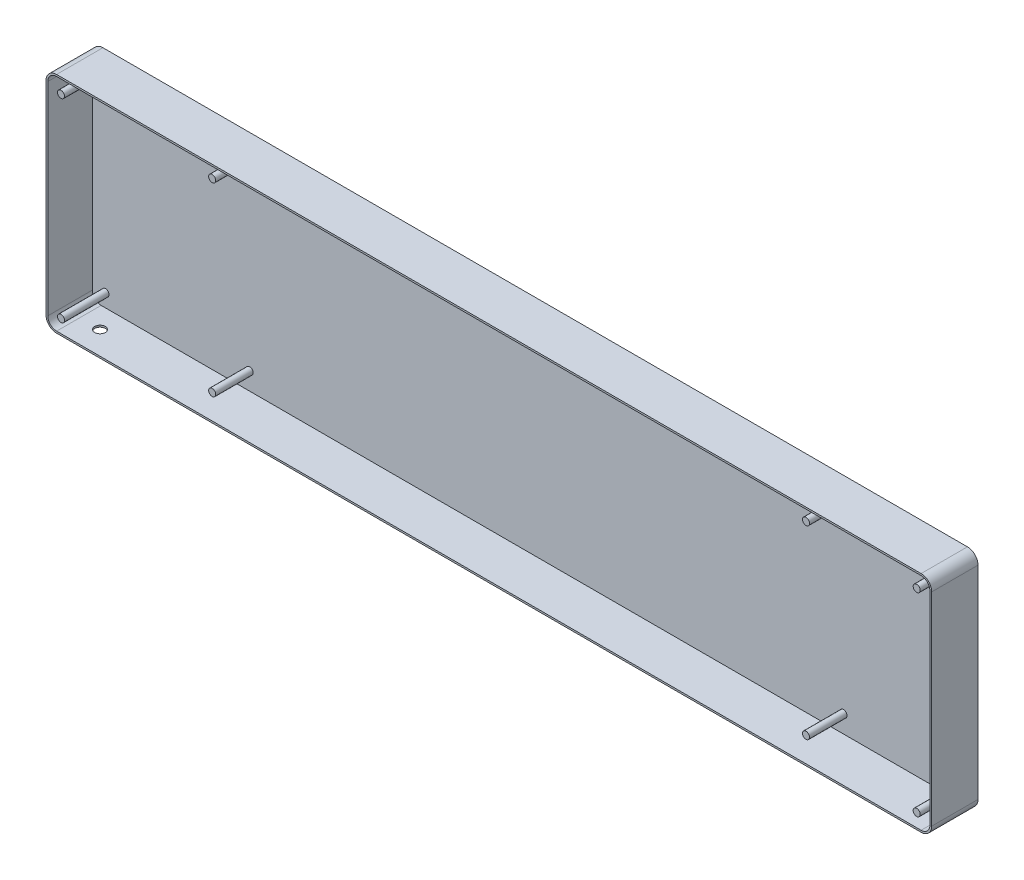
ISO-10303-21;
HEADER;
FILE_DESCRIPTION(('STEP AP214'),'2;1');
FILE_NAME('part.step','',(''),(''),'','','');
FILE_SCHEMA(('AUTOMOTIVE_DESIGN { 1 0 10303 214 1 1 1 1 }'));
ENDSEC;
DATA;
#1=APPLICATION_CONTEXT('core data for automotive mechanical design processes');
#2=APPLICATION_PROTOCOL_DEFINITION('international standard','automotive_design',2000,#1);
#3=PRODUCT_CONTEXT('',#1,'mechanical');
#4=PRODUCT('Part','Part','',(#3));
#5=PRODUCT_RELATED_PRODUCT_CATEGORY('part','',(#4));
#6=PRODUCT_DEFINITION_FORMATION('','',#4);
#7=PRODUCT_DEFINITION_CONTEXT('part definition',#1,'design');
#8=PRODUCT_DEFINITION('design','',#6,#7);
#9=PRODUCT_DEFINITION_SHAPE('','',#8);
#10=(LENGTH_UNIT() NAMED_UNIT(*) SI_UNIT(.MILLI.,.METRE.));
#11=(NAMED_UNIT(*) PLANE_ANGLE_UNIT() SI_UNIT($,.RADIAN.));
#12=(NAMED_UNIT(*) SI_UNIT($,.STERADIAN.) SOLID_ANGLE_UNIT());
#13=UNCERTAINTY_MEASURE_WITH_UNIT(LENGTH_MEASURE(1.E-05),#10,'distance_accuracy_value','');
#14=(GEOMETRIC_REPRESENTATION_CONTEXT(3) GLOBAL_UNCERTAINTY_ASSIGNED_CONTEXT((#13)) GLOBAL_UNIT_ASSIGNED_CONTEXT((#10,
#11,#12)) REPRESENTATION_CONTEXT('',''));
#15=CARTESIAN_POINT('',(0.,0.,0.));
#16=DIRECTION('',(0.,0.,1.));
#17=DIRECTION('',(1.,0.,0.));
#18=AXIS2_PLACEMENT_3D('',#15,#16,#17);
#19=CARTESIAN_POINT('',(694.778858049703,123.537159380943,-50.5));
#20=DIRECTION('',(0.,0.,1.));
#21=DIRECTION('',(1.,0.,0.));
#22=AXIS2_PLACEMENT_3D('',#19,#20,#21);
#23=CYLINDRICAL_SURFACE('',#22,12.);
#24=CARTESIAN_POINT('',(694.778858049703,123.537159380943,0.));
#25=DIRECTION('',(0.,0.,1.));
#26=DIRECTION('',(1.,0.,0.));
#27=AXIS2_PLACEMENT_3D('',#24,#25,#26);
#28=CIRCLE('',#27,12.);
#29=CARTESIAN_POINT('',(706.778858049703,123.537159380943,0.));
#30=VERTEX_POINT('',#29);
#31=CARTESIAN_POINT('',(694.778858049703,135.537159380943,0.));
#32=VERTEX_POINT('',#31);
#33=EDGE_CURVE('E249',#30,#32,#28,.T.);
#34=ORIENTED_EDGE('',*,*,#33,.F.);
#35=DIRECTION('',(0.,0.,1.));
#36=VECTOR('',#35,1.);
#37=CARTESIAN_POINT('',(706.778858049703,123.537159380943,-50.5));
#38=LINE('',#37,#36);
#39=CARTESIAN_POINT('',(706.778858049703,123.537159380943,-52.5));
#40=VERTEX_POINT('',#39);
#41=EDGE_CURVE('E284',#40,#30,#38,.T.);
#42=ORIENTED_EDGE('',*,*,#41,.F.);
#43=CARTESIAN_POINT('',(694.778858049703,123.537159380943,-52.5));
#44=DIRECTION('',(0.,0.,-1.));
#45=DIRECTION('',(-1.,0.,0.));
#46=AXIS2_PLACEMENT_3D('',#43,#44,#45);
#47=CIRCLE('',#46,12.);
#48=CARTESIAN_POINT('',(694.778858049703,135.537159380943,-52.5));
#49=VERTEX_POINT('',#48);
#50=EDGE_CURVE('E193',#49,#40,#47,.T.);
#51=ORIENTED_EDGE('',*,*,#50,.F.);
#52=DIRECTION('',(0.,0.,1.));
#53=VECTOR('',#52,1.);
#54=CARTESIAN_POINT('',(694.778858049703,135.537159380943,-50.5));
#55=LINE('',#54,#53);
#56=EDGE_CURVE('E283',#49,#32,#55,.T.);
#57=ORIENTED_EDGE('',*,*,#56,.T.);
#58=EDGE_LOOP('',(#34,#42,#51,#57));
#59=FACE_BOUND('',#58,.T.);
#60=ADVANCED_FACE('F44',(#59),#23,.T.);
#61=CARTESIAN_POINT('',(706.778858049703,-106.462840619057,-50.5));
#62=DIRECTION('',(1.,0.,0.));
#63=DIRECTION('',(0.,0.,-1.));
#64=AXIS2_PLACEMENT_3D('',#61,#62,#63);
#65=PLANE('',#64);
#66=DIRECTION('',(0.,1.,0.));
#67=VECTOR('',#66,1.);
#68=CARTESIAN_POINT('',(706.778858049703,-106.462840619057,0.));
#69=LINE('',#68,#67);
#70=CARTESIAN_POINT('',(706.778858049703,-106.462840619057,0.));
#71=VERTEX_POINT('',#70);
#72=EDGE_CURVE('E280',#71,#30,#69,.T.);
#73=ORIENTED_EDGE('',*,*,#72,.F.);
#74=DIRECTION('',(0.,0.,1.));
#75=VECTOR('',#74,1.);
#76=CARTESIAN_POINT('',(706.778858049703,-106.462840619057,-50.5));
#77=LINE('',#76,#75);
#78=CARTESIAN_POINT('',(706.778858049703,-106.462840619057,-52.5));
#79=VERTEX_POINT('',#78);
#80=EDGE_CURVE('E287',#79,#71,#77,.T.);
#81=ORIENTED_EDGE('',*,*,#80,.F.);
#82=DIRECTION('',(0.,-1.,0.));
#83=VECTOR('',#82,1.);
#84=CARTESIAN_POINT('',(706.778858049703,-106.462840619057,-52.5));
#85=LINE('',#84,#83);
#86=EDGE_CURVE('E196',#40,#79,#85,.T.);
#87=ORIENTED_EDGE('',*,*,#86,.F.);
#88=ORIENTED_EDGE('',*,*,#41,.T.);
#89=EDGE_LOOP('',(#73,#81,#87,#88));
#90=FACE_BOUND('',#89,.T.);
#91=ADVANCED_FACE('F374',(#90),#65,.T.);
#92=CARTESIAN_POINT('',(694.778858049703,-106.462840619057,-50.5));
#93=DIRECTION('',(0.,0.,1.));
#94=DIRECTION('',(1.,0.,0.));
#95=AXIS2_PLACEMENT_3D('',#92,#93,#94);
#96=CYLINDRICAL_SURFACE('',#95,12.0000000000001);
#97=CARTESIAN_POINT('',(694.778858049703,-106.462840619057,0.));
#98=DIRECTION('',(0.,0.,1.));
#99=DIRECTION('',(1.,0.,0.));
#100=AXIS2_PLACEMENT_3D('',#97,#98,#99);
#101=CIRCLE('',#100,12.0000000000001);
#102=CARTESIAN_POINT('',(694.778858049703,-118.462840619057,0.));
#103=VERTEX_POINT('',#102);
#104=EDGE_CURVE('E277',#103,#71,#101,.T.);
#105=ORIENTED_EDGE('',*,*,#104,.F.);
#106=DIRECTION('',(0.,0.,1.));
#107=VECTOR('',#106,1.);
#108=CARTESIAN_POINT('',(694.778858049703,-118.462840619057,-50.5));
#109=LINE('',#108,#107);
#110=CARTESIAN_POINT('',(694.778858049703,-118.462840619057,-52.5));
#111=VERTEX_POINT('',#110);
#112=EDGE_CURVE('E289',#111,#103,#109,.T.);
#113=ORIENTED_EDGE('',*,*,#112,.F.);
#114=CARTESIAN_POINT('',(694.778858049703,-106.462840619057,-52.5));
#115=DIRECTION('',(0.,0.,-1.));
#116=DIRECTION('',(-1.,0.,0.));
#117=AXIS2_PLACEMENT_3D('',#114,#115,#116);
#118=CIRCLE('',#117,12.0000000000001);
#119=EDGE_CURVE('E199',#79,#111,#118,.T.);
#120=ORIENTED_EDGE('',*,*,#119,.F.);
#121=ORIENTED_EDGE('',*,*,#80,.T.);
#122=EDGE_LOOP('',(#105,#113,#120,#121));
#123=FACE_BOUND('',#122,.T.);
#124=ADVANCED_FACE('F379',(#123),#96,.T.);
#125=CARTESIAN_POINT('',(-285.221141950297,-118.462840619057,-50.5));
#126=DIRECTION('',(0.,-1.,0.));
#127=DIRECTION('',(0.,0.,-1.));
#128=AXIS2_PLACEMENT_3D('',#125,#126,#127);
#129=PLANE('',#128);
#130=CARTESIAN_POINT('',(-262.221141950297,-118.462840619057,-26.25));
#131=DIRECTION('',(0.,-1.,0.));
#132=DIRECTION('',(0.,0.,-1.));
#133=AXIS2_PLACEMENT_3D('',#130,#131,#132);
#134=CIRCLE('',#133,5.99999999999999);
#135=CARTESIAN_POINT('',(-262.221141950297,-118.462840619057,-32.25));
#136=VERTEX_POINT('',#135);
#137=EDGE_CURVE('E735',#136,#136,#134,.T.);
#138=ORIENTED_EDGE('',*,*,#137,.F.);
#139=EDGE_LOOP('',(#138));
#140=FACE_BOUND('',#139,.T.);
#141=DIRECTION('',(1.,0.,0.));
#142=VECTOR('',#141,1.);
#143=CARTESIAN_POINT('',(-285.221141950297,-118.462840619057,0.));
#144=LINE('',#143,#142);
#145=CARTESIAN_POINT('',(-285.221141950297,-118.462840619057,0.));
#146=VERTEX_POINT('',#145);
#147=EDGE_CURVE('E274',#146,#103,#144,.T.);
#148=ORIENTED_EDGE('',*,*,#147,.F.);
#149=DIRECTION('',(0.,0.,1.));
#150=VECTOR('',#149,1.);
#151=CARTESIAN_POINT('',(-285.221141950297,-118.462840619057,-50.5));
#152=LINE('',#151,#150);
#153=CARTESIAN_POINT('',(-285.221141950297,-118.462840619057,-52.5));
#154=VERTEX_POINT('',#153);
#155=EDGE_CURVE('E166',#154,#146,#152,.T.);
#156=ORIENTED_EDGE('',*,*,#155,.F.);
#157=DIRECTION('',(-1.,0.,0.));
#158=VECTOR('',#157,1.);
#159=CARTESIAN_POINT('',(-285.221141950297,-118.462840619057,-52.5));
#160=LINE('',#159,#158);
#161=EDGE_CURVE('E181',#111,#154,#160,.T.);
#162=ORIENTED_EDGE('',*,*,#161,.F.);
#163=ORIENTED_EDGE('',*,*,#112,.T.);
#164=EDGE_LOOP('',(#148,#156,#162,#163));
#165=FACE_BOUND('',#164,.T.);
#166=ADVANCED_FACE('F392',(#140,#165),#129,.T.);
#167=CARTESIAN_POINT('',(-285.221141950297,-106.462840619057,-50.5));
#168=DIRECTION('',(0.,0.,1.));
#169=DIRECTION('',(1.,0.,0.));
#170=AXIS2_PLACEMENT_3D('',#167,#168,#169);
#171=CYLINDRICAL_SURFACE('',#170,12.);
#172=CARTESIAN_POINT('',(-285.221141950297,-106.462840619057,0.));
#173=DIRECTION('',(0.,0.,1.));
#174=DIRECTION('',(1.,0.,0.));
#175=AXIS2_PLACEMENT_3D('',#172,#173,#174);
#176=CIRCLE('',#175,12.);
#177=CARTESIAN_POINT('',(-297.221141950297,-106.462840619057,0.));
#178=VERTEX_POINT('',#177);
#179=EDGE_CURVE('E162',#178,#146,#176,.T.);
#180=ORIENTED_EDGE('',*,*,#179,.F.);
#181=DIRECTION('',(0.,0.,1.));
#182=VECTOR('',#181,1.);
#183=CARTESIAN_POINT('',(-297.221141950297,-106.462840619057,-50.5));
#184=LINE('',#183,#182);
#185=CARTESIAN_POINT('',(-297.221141950297,-106.462840619057,-52.5));
#186=VERTEX_POINT('',#185);
#187=EDGE_CURVE('E156',#186,#178,#184,.T.);
#188=ORIENTED_EDGE('',*,*,#187,.F.);
#189=CARTESIAN_POINT('',(-285.221141950297,-106.462840619057,-52.5));
#190=DIRECTION('',(0.,0.,-1.));
#191=DIRECTION('',(-1.,0.,0.));
#192=AXIS2_PLACEMENT_3D('',#189,#190,#191);
#193=CIRCLE('',#192,12.);
#194=EDGE_CURVE('E160',#154,#186,#193,.T.);
#195=ORIENTED_EDGE('',*,*,#194,.F.);
#196=ORIENTED_EDGE('',*,*,#155,.T.);
#197=EDGE_LOOP('',(#180,#188,#195,#196));
#198=FACE_BOUND('',#197,.T.);
#199=ADVANCED_FACE('F158',(#198),#171,.T.);
#200=CARTESIAN_POINT('',(-297.221141950297,123.537159380943,-50.5));
#201=DIRECTION('',(-1.,0.,0.));
#202=DIRECTION('',(0.,0.,1.));
#203=AXIS2_PLACEMENT_3D('',#200,#201,#202);
#204=PLANE('',#203);
#205=DIRECTION('',(0.,-1.,0.));
#206=VECTOR('',#205,1.);
#207=CARTESIAN_POINT('',(-297.221141950297,123.537159380943,0.));
#208=LINE('',#207,#206);
#209=CARTESIAN_POINT('',(-297.221141950297,123.537159380943,0.));
#210=VERTEX_POINT('',#209);
#211=EDGE_CURVE('E271',#210,#178,#208,.T.);
#212=ORIENTED_EDGE('',*,*,#211,.F.);
#213=DIRECTION('',(0.,0.,1.));
#214=VECTOR('',#213,1.);
#215=CARTESIAN_POINT('',(-297.221141950297,123.537159380943,-50.5));
#216=LINE('',#215,#214);
#217=CARTESIAN_POINT('',(-297.221141950297,123.537159380943,-52.5));
#218=VERTEX_POINT('',#217);
#219=EDGE_CURVE('E167',#218,#210,#216,.T.);
#220=ORIENTED_EDGE('',*,*,#219,.F.);
#221=DIRECTION('',(0.,1.,0.));
#222=VECTOR('',#221,1.);
#223=CARTESIAN_POINT('',(-297.221141950297,123.537159380943,-52.5));
#224=LINE('',#223,#222);
#225=EDGE_CURVE('E170',#186,#218,#224,.T.);
#226=ORIENTED_EDGE('',*,*,#225,.F.);
#227=ORIENTED_EDGE('',*,*,#187,.T.);
#228=EDGE_LOOP('',(#212,#220,#226,#227));
#229=FACE_BOUND('',#228,.T.);
#230=ADVANCED_FACE('F171',(#229),#204,.T.);
#231=CARTESIAN_POINT('',(-285.221141950297,123.537159380943,-50.5));
#232=DIRECTION('',(0.,0.,1.));
#233=DIRECTION('',(1.,0.,0.));
#234=AXIS2_PLACEMENT_3D('',#231,#232,#233);
#235=CYLINDRICAL_SURFACE('',#234,12.0000000000001);
#236=CARTESIAN_POINT('',(-285.221141950297,123.537159380943,0.));
#237=DIRECTION('',(0.,0.,1.));
#238=DIRECTION('',(1.,0.,0.));
#239=AXIS2_PLACEMENT_3D('',#236,#237,#238);
#240=CIRCLE('',#239,12.0000000000001);
#241=CARTESIAN_POINT('',(-285.221141950297,135.537159380943,0.));
#242=VERTEX_POINT('',#241);
#243=EDGE_CURVE('E268',#242,#210,#240,.T.);
#244=ORIENTED_EDGE('',*,*,#243,.F.);
#245=DIRECTION('',(0.,0.,1.));
#246=VECTOR('',#245,1.);
#247=CARTESIAN_POINT('',(-285.221141950297,135.537159380943,-50.5));
#248=LINE('',#247,#246);
#249=CARTESIAN_POINT('',(-285.221141950297,135.537159380943,-52.5));
#250=VERTEX_POINT('',#249);
#251=EDGE_CURVE('E293',#250,#242,#248,.T.);
#252=ORIENTED_EDGE('',*,*,#251,.F.);
#253=CARTESIAN_POINT('',(-285.221141950297,123.537159380943,-52.5));
#254=DIRECTION('',(0.,0.,-1.));
#255=DIRECTION('',(-1.,0.,0.));
#256=AXIS2_PLACEMENT_3D('',#253,#254,#255);
#257=CIRCLE('',#256,12.0000000000001);
#258=EDGE_CURVE('E175',#218,#250,#257,.T.);
#259=ORIENTED_EDGE('',*,*,#258,.F.);
#260=ORIENTED_EDGE('',*,*,#219,.T.);
#261=EDGE_LOOP('',(#244,#252,#259,#260));
#262=FACE_BOUND('',#261,.T.);
#263=ADVANCED_FACE('F395',(#262),#235,.T.);
#264=CARTESIAN_POINT('',(694.778858049703,135.537159380943,-50.5));
#265=DIRECTION('',(0.,1.,0.));
#266=DIRECTION('',(0.,0.,1.));
#267=AXIS2_PLACEMENT_3D('',#264,#265,#266);
#268=PLANE('',#267);
#269=DIRECTION('',(-1.,0.,0.));
#270=VECTOR('',#269,1.);
#271=CARTESIAN_POINT('',(694.778858049703,135.537159380943,0.));
#272=LINE('',#271,#270);
#273=EDGE_CURVE('E265',#32,#242,#272,.T.);
#274=ORIENTED_EDGE('',*,*,#273,.F.);
#275=ORIENTED_EDGE('',*,*,#56,.F.);
#276=DIRECTION('',(1.,0.,0.));
#277=VECTOR('',#276,1.);
#278=CARTESIAN_POINT('',(694.778858049703,135.537159380943,-52.5));
#279=LINE('',#278,#277);
#280=EDGE_CURVE('E190',#250,#49,#279,.T.);
#281=ORIENTED_EDGE('',*,*,#280,.F.);
#282=ORIENTED_EDGE('',*,*,#251,.T.);
#283=EDGE_LOOP('',(#274,#275,#281,#282));
#284=FACE_BOUND('',#283,.T.);
#285=ADVANCED_FACE('F398',(#284),#268,.T.);
#286=CARTESIAN_POINT('',(694.778858049703,123.537159380943,0.));
#287=DIRECTION('',(0.,0.,1.));
#288=DIRECTION('',(1.,0.,0.));
#289=AXIS2_PLACEMENT_3D('',#286,#287,#288);
#290=PLANE('',#289);
#291=CARTESIAN_POINT('',(-285.221141950297,-106.462840619057,0.));
#292=DIRECTION('',(0.,0.,1.));
#293=DIRECTION('',(1.,0.,0.));
#294=AXIS2_PLACEMENT_3D('',#291,#292,#293);
#295=CIRCLE('',#294,10.);
#296=CARTESIAN_POINT('',(-295.221141950297,-106.462840619057,0.));
#297=VERTEX_POINT('',#296);
#298=CARTESIAN_POINT('',(-285.221141950297,-116.462840619057,0.));
#299=VERTEX_POINT('',#298);
#300=EDGE_CURVE('E66',#297,#299,#295,.T.);
#301=ORIENTED_EDGE('',*,*,#300,.F.);
#302=DIRECTION('',(0.,-1.,0.));
#303=VECTOR('',#302,1.);
#304=CARTESIAN_POINT('',(-295.221141950297,123.537159380943,0.));
#305=LINE('',#304,#303);
#306=CARTESIAN_POINT('',(-295.221141950297,123.537159380943,0.));
#307=VERTEX_POINT('',#306);
#308=EDGE_CURVE('E206',#307,#297,#305,.T.);
#309=ORIENTED_EDGE('',*,*,#308,.F.);
#310=CARTESIAN_POINT('',(-285.221141950297,123.537159380943,0.));
#311=DIRECTION('',(0.,0.,1.));
#312=DIRECTION('',(1.,0.,0.));
#313=AXIS2_PLACEMENT_3D('',#310,#311,#312);
#314=CIRCLE('',#313,10.);
#315=CARTESIAN_POINT('',(-285.221141950297,133.537159380943,0.));
#316=VERTEX_POINT('',#315);
#317=EDGE_CURVE('E242',#316,#307,#314,.T.);
#318=ORIENTED_EDGE('',*,*,#317,.F.);
#319=DIRECTION('',(-1.,0.,0.));
#320=VECTOR('',#319,1.);
#321=CARTESIAN_POINT('',(694.778858049703,133.537159380943,0.));
#322=LINE('',#321,#320);
#323=CARTESIAN_POINT('',(694.778858049703,133.537159380943,0.));
#324=VERTEX_POINT('',#323);
#325=EDGE_CURVE('E239',#324,#316,#322,.T.);
#326=ORIENTED_EDGE('',*,*,#325,.F.);
#327=CARTESIAN_POINT('',(694.778858049703,123.537159380943,0.));
#328=DIRECTION('',(0.,0.,1.));
#329=DIRECTION('',(1.,0.,0.));
#330=AXIS2_PLACEMENT_3D('',#327,#328,#329);
#331=CIRCLE('',#330,10.);
#332=CARTESIAN_POINT('',(704.778858049703,123.537159380943,0.));
#333=VERTEX_POINT('',#332);
#334=EDGE_CURVE('E236',#333,#324,#331,.T.);
#335=ORIENTED_EDGE('',*,*,#334,.F.);
#336=DIRECTION('',(0.,1.,0.));
#337=VECTOR('',#336,1.);
#338=CARTESIAN_POINT('',(704.778858049703,-106.462840619057,0.));
#339=LINE('',#338,#337);
#340=CARTESIAN_POINT('',(704.778858049703,-106.462840619057,0.));
#341=VERTEX_POINT('',#340);
#342=EDGE_CURVE('E233',#341,#333,#339,.T.);
#343=ORIENTED_EDGE('',*,*,#342,.F.);
#344=CARTESIAN_POINT('',(694.778858049703,-106.462840619057,0.));
#345=DIRECTION('',(0.,0.,1.));
#346=DIRECTION('',(1.,0.,0.));
#347=AXIS2_PLACEMENT_3D('',#344,#345,#346);
#348=CIRCLE('',#347,10.);
#349=CARTESIAN_POINT('',(694.778858049703,-116.462840619057,0.));
#350=VERTEX_POINT('',#349);
#351=EDGE_CURVE('E230',#350,#341,#348,.T.);
#352=ORIENTED_EDGE('',*,*,#351,.F.);
#353=DIRECTION('',(1.,0.,0.));
#354=VECTOR('',#353,1.);
#355=CARTESIAN_POINT('',(-285.221141950297,-116.462840619057,0.));
#356=LINE('',#355,#354);
#357=EDGE_CURVE('E227',#299,#350,#356,.T.);
#358=ORIENTED_EDGE('',*,*,#357,.F.);
#359=EDGE_LOOP('',(#301,#309,#318,#326,#335,#343,#352,#358));
#360=FACE_BOUND('',#359,.T.);
#361=ORIENTED_EDGE('',*,*,#33,.T.);
#362=ORIENTED_EDGE('',*,*,#273,.T.);
#363=ORIENTED_EDGE('',*,*,#243,.T.);
#364=ORIENTED_EDGE('',*,*,#211,.T.);
#365=ORIENTED_EDGE('',*,*,#179,.T.);
#366=ORIENTED_EDGE('',*,*,#147,.T.);
#367=ORIENTED_EDGE('',*,*,#104,.T.);
#368=ORIENTED_EDGE('',*,*,#72,.T.);
#369=EDGE_LOOP('',(#361,#362,#363,#364,#365,#366,#367,#368));
#370=FACE_BOUND('',#369,.T.);
#371=ADVANCED_FACE('F355',(#360,#370),#290,.T.);
#372=CARTESIAN_POINT('',(-285.221141950297,-106.462840619057,-50.5));
#373=DIRECTION('',(0.,0.,1.));
#374=DIRECTION('',(1.,0.,0.));
#375=AXIS2_PLACEMENT_3D('',#372,#373,#374);
#376=CYLINDRICAL_SURFACE('',#375,10.);
#377=ORIENTED_EDGE('',*,*,#300,.T.);
#378=DIRECTION('',(0.,0.,1.));
#379=VECTOR('',#378,1.);
#380=CARTESIAN_POINT('',(-285.221141950297,-116.462840619057,-50.5));
#381=LINE('',#380,#379);
#382=CARTESIAN_POINT('',(-285.221141950297,-116.462840619057,-50.5));
#383=VERTEX_POINT('',#382);
#384=EDGE_CURVE('E225',#383,#299,#381,.T.);
#385=ORIENTED_EDGE('',*,*,#384,.F.);
#386=CARTESIAN_POINT('',(-285.221141950297,-106.462840619057,-50.5));
#387=DIRECTION('',(0.,0.,1.));
#388=DIRECTION('',(1.,0.,0.));
#389=AXIS2_PLACEMENT_3D('',#386,#387,#388);
#390=CIRCLE('',#389,10.);
#391=CARTESIAN_POINT('',(-295.221141950297,-106.462840619057,-50.5));
#392=VERTEX_POINT('',#391);
#393=EDGE_CURVE('E202',#392,#383,#390,.T.);
#394=ORIENTED_EDGE('',*,*,#393,.F.);
#395=DIRECTION('',(0.,0.,1.));
#396=VECTOR('',#395,1.);
#397=CARTESIAN_POINT('',(-295.221141950297,-106.462840619057,-50.5));
#398=LINE('',#397,#396);
#399=EDGE_CURVE('E247',#392,#297,#398,.T.);
#400=ORIENTED_EDGE('',*,*,#399,.T.);
#401=EDGE_LOOP('',(#377,#385,#394,#400));
#402=FACE_BOUND('',#401,.T.);
#403=ADVANCED_FACE('F345',(#402),#376,.F.);
#404=CARTESIAN_POINT('',(-295.221141950297,123.537159380943,-50.5));
#405=DIRECTION('',(-1.,0.,0.));
#406=DIRECTION('',(0.,0.,1.));
#407=AXIS2_PLACEMENT_3D('',#404,#405,#406);
#408=PLANE('',#407);
#409=ORIENTED_EDGE('',*,*,#308,.T.);
#410=ORIENTED_EDGE('',*,*,#399,.F.);
#411=DIRECTION('',(0.,-1.,0.));
#412=VECTOR('',#411,1.);
#413=CARTESIAN_POINT('',(-295.221141950297,123.537159380943,-50.5));
#414=LINE('',#413,#412);
#415=CARTESIAN_POINT('',(-295.221141950297,123.537159380943,-50.5));
#416=VERTEX_POINT('',#415);
#417=EDGE_CURVE('E222',#416,#392,#414,.T.);
#418=ORIENTED_EDGE('',*,*,#417,.F.);
#419=DIRECTION('',(0.,0.,1.));
#420=VECTOR('',#419,1.);
#421=CARTESIAN_POINT('',(-295.221141950297,123.537159380943,-50.5));
#422=LINE('',#421,#420);
#423=EDGE_CURVE('E250',#416,#307,#422,.T.);
#424=ORIENTED_EDGE('',*,*,#423,.T.);
#425=EDGE_LOOP('',(#409,#410,#418,#424));
#426=FACE_BOUND('',#425,.T.);
#427=ADVANCED_FACE('F343',(#426),#408,.F.);
#428=CARTESIAN_POINT('',(-285.221141950297,123.537159380943,-50.5));
#429=DIRECTION('',(0.,0.,1.));
#430=DIRECTION('',(1.,0.,0.));
#431=AXIS2_PLACEMENT_3D('',#428,#429,#430);
#432=CYLINDRICAL_SURFACE('',#431,10.);
#433=ORIENTED_EDGE('',*,*,#317,.T.);
#434=ORIENTED_EDGE('',*,*,#423,.F.);
#435=CARTESIAN_POINT('',(-285.221141950297,123.537159380943,-50.5));
#436=DIRECTION('',(0.,0.,1.));
#437=DIRECTION('',(1.,0.,0.));
#438=AXIS2_PLACEMENT_3D('',#435,#436,#437);
#439=CIRCLE('',#438,10.);
#440=CARTESIAN_POINT('',(-285.221141950297,133.537159380943,-50.5));
#441=VERTEX_POINT('',#440);
#442=EDGE_CURVE('E219',#441,#416,#439,.T.);
#443=ORIENTED_EDGE('',*,*,#442,.F.);
#444=DIRECTION('',(0.,0.,1.));
#445=VECTOR('',#444,1.);
#446=CARTESIAN_POINT('',(-285.221141950297,133.537159380943,-50.5));
#447=LINE('',#446,#445);
#448=EDGE_CURVE('E252',#441,#316,#447,.T.);
#449=ORIENTED_EDGE('',*,*,#448,.T.);
#450=EDGE_LOOP('',(#433,#434,#443,#449));
#451=FACE_BOUND('',#450,.T.);
#452=ADVANCED_FACE('F339',(#451),#432,.F.);
#453=CARTESIAN_POINT('',(694.778858049703,133.537159380943,-50.5));
#454=DIRECTION('',(0.,1.,0.));
#455=DIRECTION('',(-1.,0.,0.));
#456=AXIS2_PLACEMENT_3D('',#453,#454,#455);
#457=PLANE('',#456);
#458=ORIENTED_EDGE('',*,*,#325,.T.);
#459=ORIENTED_EDGE('',*,*,#448,.F.);
#460=DIRECTION('',(-1.,0.,0.));
#461=VECTOR('',#460,1.);
#462=CARTESIAN_POINT('',(694.778858049703,133.537159380943,-50.5));
#463=LINE('',#462,#461);
#464=CARTESIAN_POINT('',(694.778858049703,133.537159380943,-50.5));
#465=VERTEX_POINT('',#464);
#466=EDGE_CURVE('E216',#465,#441,#463,.T.);
#467=ORIENTED_EDGE('',*,*,#466,.F.);
#468=DIRECTION('',(0.,0.,1.));
#469=VECTOR('',#468,1.);
#470=CARTESIAN_POINT('',(694.778858049703,133.537159380943,-50.5));
#471=LINE('',#470,#469);
#472=EDGE_CURVE('E254',#465,#324,#471,.T.);
#473=ORIENTED_EDGE('',*,*,#472,.T.);
#474=EDGE_LOOP('',(#458,#459,#467,#473));
#475=FACE_BOUND('',#474,.T.);
#476=ADVANCED_FACE('F364',(#475),#457,.F.);
#477=CARTESIAN_POINT('',(694.778858049703,123.537159380943,-50.5));
#478=DIRECTION('',(0.,0.,1.));
#479=DIRECTION('',(1.,0.,0.));
#480=AXIS2_PLACEMENT_3D('',#477,#478,#479);
#481=CYLINDRICAL_SURFACE('',#480,10.);
#482=ORIENTED_EDGE('',*,*,#334,.T.);
#483=ORIENTED_EDGE('',*,*,#472,.F.);
#484=CARTESIAN_POINT('',(694.778858049703,123.537159380943,-50.5));
#485=DIRECTION('',(0.,0.,1.));
#486=DIRECTION('',(1.,0.,0.));
#487=AXIS2_PLACEMENT_3D('',#484,#485,#486);
#488=CIRCLE('',#487,10.);
#489=CARTESIAN_POINT('',(704.778858049703,123.537159380943,-50.5));
#490=VERTEX_POINT('',#489);
#491=EDGE_CURVE('E213',#490,#465,#488,.T.);
#492=ORIENTED_EDGE('',*,*,#491,.F.);
#493=DIRECTION('',(0.,0.,1.));
#494=VECTOR('',#493,1.);
#495=CARTESIAN_POINT('',(704.778858049703,123.537159380943,-50.5));
#496=LINE('',#495,#494);
#497=EDGE_CURVE('E256',#490,#333,#496,.T.);
#498=ORIENTED_EDGE('',*,*,#497,.T.);
#499=EDGE_LOOP('',(#482,#483,#492,#498));
#500=FACE_BOUND('',#499,.T.);
#501=ADVANCED_FACE('F362',(#500),#481,.F.);
#502=CARTESIAN_POINT('',(704.778858049703,-106.462840619057,-50.5));
#503=DIRECTION('',(1.,0.,0.));
#504=DIRECTION('',(0.,0.,-1.));
#505=AXIS2_PLACEMENT_3D('',#502,#503,#504);
#506=PLANE('',#505);
#507=ORIENTED_EDGE('',*,*,#342,.T.);
#508=ORIENTED_EDGE('',*,*,#497,.F.);
#509=DIRECTION('',(0.,1.,0.));
#510=VECTOR('',#509,1.);
#511=CARTESIAN_POINT('',(704.778858049703,-106.462840619057,-50.5));
#512=LINE('',#511,#510);
#513=CARTESIAN_POINT('',(704.778858049703,-106.462840619057,-50.5));
#514=VERTEX_POINT('',#513);
#515=EDGE_CURVE('E210',#514,#490,#512,.T.);
#516=ORIENTED_EDGE('',*,*,#515,.F.);
#517=DIRECTION('',(0.,0.,1.));
#518=VECTOR('',#517,1.);
#519=CARTESIAN_POINT('',(704.778858049703,-106.462840619057,-50.5));
#520=LINE('',#519,#518);
#521=EDGE_CURVE('E258',#514,#341,#520,.T.);
#522=ORIENTED_EDGE('',*,*,#521,.T.);
#523=EDGE_LOOP('',(#507,#508,#516,#522));
#524=FACE_BOUND('',#523,.T.);
#525=ADVANCED_FACE('F359',(#524),#506,.F.);
#526=CARTESIAN_POINT('',(694.778858049703,-106.462840619057,-50.5));
#527=DIRECTION('',(0.,0.,1.));
#528=DIRECTION('',(1.,0.,0.));
#529=AXIS2_PLACEMENT_3D('',#526,#527,#528);
#530=CYLINDRICAL_SURFACE('',#529,10.);
#531=ORIENTED_EDGE('',*,*,#351,.T.);
#532=ORIENTED_EDGE('',*,*,#521,.F.);
#533=CARTESIAN_POINT('',(694.778858049703,-106.462840619057,-50.5));
#534=DIRECTION('',(0.,0.,1.));
#535=DIRECTION('',(1.,0.,0.));
#536=AXIS2_PLACEMENT_3D('',#533,#534,#535);
#537=CIRCLE('',#536,10.);
#538=CARTESIAN_POINT('',(694.778858049703,-116.462840619057,-50.5));
#539=VERTEX_POINT('',#538);
#540=EDGE_CURVE('E58',#539,#514,#537,.T.);
#541=ORIENTED_EDGE('',*,*,#540,.F.);
#542=DIRECTION('',(0.,0.,1.));
#543=VECTOR('',#542,1.);
#544=CARTESIAN_POINT('',(694.778858049703,-116.462840619057,-50.5));
#545=LINE('',#544,#543);
#546=EDGE_CURVE('E260',#539,#350,#545,.T.);
#547=ORIENTED_EDGE('',*,*,#546,.T.);
#548=EDGE_LOOP('',(#531,#532,#541,#547));
#549=FACE_BOUND('',#548,.T.);
#550=ADVANCED_FACE('F350',(#549),#530,.F.);
#551=CARTESIAN_POINT('',(-285.221141950297,-116.462840619057,-50.5));
#552=DIRECTION('',(0.,-1.,0.));
#553=DIRECTION('',(1.,0.,0.));
#554=AXIS2_PLACEMENT_3D('',#551,#552,#553);
#555=PLANE('',#554);
#556=CARTESIAN_POINT('',(-262.221141950297,-116.462840619057,-26.25));
#557=DIRECTION('',(0.,-1.,0.));
#558=DIRECTION('',(0.,0.,-1.));
#559=AXIS2_PLACEMENT_3D('',#556,#557,#558);
#560=CIRCLE('',#559,5.99999999999999);
#561=CARTESIAN_POINT('',(-262.221141950297,-116.462840619057,-32.25));
#562=VERTEX_POINT('',#561);
#563=EDGE_CURVE('E732',#562,#562,#560,.T.);
#564=ORIENTED_EDGE('',*,*,#563,.T.);
#565=EDGE_LOOP('',(#564));
#566=FACE_BOUND('',#565,.T.);
#567=ORIENTED_EDGE('',*,*,#357,.T.);
#568=ORIENTED_EDGE('',*,*,#546,.F.);
#569=DIRECTION('',(1.,0.,0.));
#570=VECTOR('',#569,1.);
#571=CARTESIAN_POINT('',(-285.221141950297,-116.462840619057,-50.5));
#572=LINE('',#571,#570);
#573=EDGE_CURVE('E205',#383,#539,#572,.T.);
#574=ORIENTED_EDGE('',*,*,#573,.F.);
#575=ORIENTED_EDGE('',*,*,#384,.T.);
#576=EDGE_LOOP('',(#567,#568,#574,#575));
#577=FACE_BOUND('',#576,.T.);
#578=ADVANCED_FACE('F320',(#566,#577),#555,.F.);
#579=CARTESIAN_POINT('',(-285.221141950297,-106.462840619057,-50.5));
#580=DIRECTION('',(0.,0.,-1.));
#581=DIRECTION('',(-1.,0.,0.));
#582=AXIS2_PLACEMENT_3D('',#579,#580,#581);
#583=PLANE('',#582);
#584=CARTESIAN_POINT('',(556.289518221485,-96.4628406190563,-50.5));
#585=DIRECTION('',(0.,0.,-1.));
#586=DIRECTION('',(-1.,0.,0.));
#587=AXIS2_PLACEMENT_3D('',#584,#585,#586);
#588=CIRCLE('',#587,3.99999999999999);
#589=CARTESIAN_POINT('',(552.289518221485,-96.4628406190563,-50.5));
#590=VERTEX_POINT('',#589);
#591=EDGE_CURVE('E13',#590,#590,#588,.F.);
#592=ORIENTED_EDGE('',*,*,#591,.F.);
#593=EDGE_LOOP('',(#592));
#594=FACE_BOUND('',#593,.T.);
#595=CARTESIAN_POINT('',(556.289518221485,113.537159380944,-50.5));
#596=DIRECTION('',(0.,0.,-1.));
#597=DIRECTION('',(-1.,0.,0.));
#598=AXIS2_PLACEMENT_3D('',#595,#596,#597);
#599=CIRCLE('',#598,3.99999999999999);
#600=CARTESIAN_POINT('',(552.289518221485,113.537159380944,-50.5));
#601=VERTEX_POINT('',#600);
#602=EDGE_CURVE('E51',#601,#601,#599,.F.);
#603=ORIENTED_EDGE('',*,*,#602,.F.);
#604=EDGE_LOOP('',(#603));
#605=FACE_BOUND('',#604,.T.);
#606=CARTESIAN_POINT('',(-116.842462293855,-96.4628406190567,-50.5));
#607=DIRECTION('',(0.,0.,-1.));
#608=DIRECTION('',(-1.,0.,0.));
#609=AXIS2_PLACEMENT_3D('',#606,#607,#608);
#610=CIRCLE('',#609,4.00000000000001);
#611=CARTESIAN_POINT('',(-120.842462293855,-96.4628406190567,-50.5));
#612=VERTEX_POINT('',#611);
#613=EDGE_CURVE('E310',#612,#612,#610,.F.);
#614=ORIENTED_EDGE('',*,*,#613,.F.);
#615=EDGE_LOOP('',(#614));
#616=FACE_BOUND('',#615,.T.);
#617=CARTESIAN_POINT('',(-116.842462293855,113.537159380943,-50.5));
#618=DIRECTION('',(0.,0.,-1.));
#619=DIRECTION('',(-1.,0.,0.));
#620=AXIS2_PLACEMENT_3D('',#617,#618,#619);
#621=CIRCLE('',#620,4.00000000000001);
#622=CARTESIAN_POINT('',(-120.842462293855,113.537159380943,-50.5));
#623=VERTEX_POINT('',#622);
#624=EDGE_CURVE('E307',#623,#623,#621,.F.);
#625=ORIENTED_EDGE('',*,*,#624,.F.);
#626=EDGE_LOOP('',(#625));
#627=FACE_BOUND('',#626,.T.);
#628=CARTESIAN_POINT('',(689.778858049703,118.537159380943,-50.5));
#629=DIRECTION('',(0.,0.,-1.));
#630=DIRECTION('',(-1.,0.,0.));
#631=AXIS2_PLACEMENT_3D('',#628,#629,#630);
#632=CIRCLE('',#631,3.99999999999999);
#633=CARTESIAN_POINT('',(685.778858049703,118.537159380943,-50.5));
#634=VERTEX_POINT('',#633);
#635=EDGE_CURVE('E304',#634,#634,#632,.F.);
#636=ORIENTED_EDGE('',*,*,#635,.F.);
#637=EDGE_LOOP('',(#636));
#638=FACE_BOUND('',#637,.T.);
#639=CARTESIAN_POINT('',(689.778858049703,-101.462840619057,-50.5));
#640=DIRECTION('',(0.,0.,-1.));
#641=DIRECTION('',(-1.,0.,0.));
#642=AXIS2_PLACEMENT_3D('',#639,#640,#641);
#643=CIRCLE('',#642,3.99999999999999);
#644=CARTESIAN_POINT('',(685.778858049703,-101.462840619057,-50.5));
#645=VERTEX_POINT('',#644);
#646=EDGE_CURVE('E301',#645,#645,#643,.F.);
#647=ORIENTED_EDGE('',*,*,#646,.F.);
#648=EDGE_LOOP('',(#647));
#649=FACE_BOUND('',#648,.T.);
#650=CARTESIAN_POINT('',(-280.221141950297,-101.462840619057,-50.5));
#651=DIRECTION('',(0.,0.,-1.));
#652=DIRECTION('',(-1.,0.,0.));
#653=AXIS2_PLACEMENT_3D('',#650,#651,#652);
#654=CIRCLE('',#653,3.99999999999999);
#655=CARTESIAN_POINT('',(-284.221141950297,-101.462840619057,-50.5));
#656=VERTEX_POINT('',#655);
#657=EDGE_CURVE('E298',#656,#656,#654,.F.);
#658=ORIENTED_EDGE('',*,*,#657,.F.);
#659=EDGE_LOOP('',(#658));
#660=FACE_BOUND('',#659,.T.);
#661=CARTESIAN_POINT('',(-280.221141950297,118.537159380943,-50.5));
#662=DIRECTION('',(0.,0.,-1.));
#663=DIRECTION('',(-1.,0.,0.));
#664=AXIS2_PLACEMENT_3D('',#661,#662,#663);
#665=CIRCLE('',#664,3.99999999999999);
#666=CARTESIAN_POINT('',(-284.221141950297,118.537159380943,-50.5));
#667=VERTEX_POINT('',#666);
#668=EDGE_CURVE('E286',#667,#667,#665,.F.);
#669=ORIENTED_EDGE('',*,*,#668,.F.);
#670=EDGE_LOOP('',(#669));
#671=FACE_BOUND('',#670,.T.);
#672=ORIENTED_EDGE('',*,*,#442,.T.);
#673=ORIENTED_EDGE('',*,*,#417,.T.);
#674=ORIENTED_EDGE('',*,*,#393,.T.);
#675=ORIENTED_EDGE('',*,*,#573,.T.);
#676=ORIENTED_EDGE('',*,*,#540,.T.);
#677=ORIENTED_EDGE('',*,*,#515,.T.);
#678=ORIENTED_EDGE('',*,*,#491,.T.);
#679=ORIENTED_EDGE('',*,*,#466,.T.);
#680=EDGE_LOOP('',(#672,#673,#674,#675,#676,#677,#678,#679));
#681=FACE_BOUND('',#680,.T.);
#682=ADVANCED_FACE('F317',(#594,#605,#616,#627,#638,#649,#660,#671,#681),#583,.F.);
#683=CARTESIAN_POINT('',(-285.221141950297,-106.462840619057,-52.5));
#684=DIRECTION('',(0.,0.,-1.));
#685=DIRECTION('',(-1.,0.,0.));
#686=AXIS2_PLACEMENT_3D('',#683,#684,#685);
#687=PLANE('',#686);
#688=ORIENTED_EDGE('',*,*,#194,.T.);
#689=ORIENTED_EDGE('',*,*,#225,.T.);
#690=ORIENTED_EDGE('',*,*,#258,.T.);
#691=ORIENTED_EDGE('',*,*,#280,.T.);
#692=ORIENTED_EDGE('',*,*,#50,.T.);
#693=ORIENTED_EDGE('',*,*,#86,.T.);
#694=ORIENTED_EDGE('',*,*,#119,.T.);
#695=ORIENTED_EDGE('',*,*,#161,.T.);
#696=EDGE_LOOP('',(#688,#689,#690,#691,#692,#693,#694,#695));
#697=FACE_BOUND('',#696,.T.);
#698=ADVANCED_FACE('F178',(#697),#687,.T.);
#699=CARTESIAN_POINT('',(-280.221141950297,118.537159380943,11.3137084989847));
#700=DIRECTION('',(0.,0.,-1.));
#701=DIRECTION('',(-1.,0.,0.));
#702=AXIS2_PLACEMENT_3D('',#699,#700,#701);
#703=CYLINDRICAL_SURFACE('',#702,3.99999999999999);
#704=ORIENTED_EDGE('',*,*,#668,.T.);
#705=EDGE_LOOP('',(#704));
#706=FACE_BOUND('',#705,.T.);
#707=CARTESIAN_POINT('',(-280.221141950297,118.537159380943,0.));
#708=DIRECTION('',(0.,0.,1.));
#709=DIRECTION('',(1.,0.,0.));
#710=AXIS2_PLACEMENT_3D('',#707,#708,#709);
#711=CIRCLE('',#710,3.99999999999999);
#712=CARTESIAN_POINT('',(-276.221141950297,118.537159380943,0.));
#713=VERTEX_POINT('',#712);
#714=EDGE_CURVE('E182',#713,#713,#711,.T.);
#715=ORIENTED_EDGE('',*,*,#714,.F.);
#716=EDGE_LOOP('',(#715));
#717=FACE_BOUND('',#716,.T.);
#718=ADVANCED_FACE('F450',(#706,#717),#703,.T.);
#719=CARTESIAN_POINT('',(694.778858049703,123.537159380943,0.));
#720=DIRECTION('',(0.,0.,1.));
#721=DIRECTION('',(1.,0.,0.));
#722=AXIS2_PLACEMENT_3D('',#719,#720,#721);
#723=PLANE('',#722);
#724=ORIENTED_EDGE('',*,*,#714,.T.);
#725=EDGE_LOOP('',(#724));
#726=FACE_BOUND('',#725,.T.);
#727=ADVANCED_FACE('F457',(#726),#723,.T.);
#728=CARTESIAN_POINT('',(-280.221141950297,-101.462840619057,11.3137084989847));
#729=DIRECTION('',(0.,0.,-1.));
#730=DIRECTION('',(-1.,0.,0.));
#731=AXIS2_PLACEMENT_3D('',#728,#729,#730);
#732=CYLINDRICAL_SURFACE('',#731,3.99999999999999);
#733=ORIENTED_EDGE('',*,*,#657,.T.);
#734=EDGE_LOOP('',(#733));
#735=FACE_BOUND('',#734,.T.);
#736=CARTESIAN_POINT('',(-280.221141950297,-101.462840619057,0.));
#737=DIRECTION('',(0.,0.,1.));
#738=DIRECTION('',(1.,0.,0.));
#739=AXIS2_PLACEMENT_3D('',#736,#737,#738);
#740=CIRCLE('',#739,3.99999999999999);
#741=CARTESIAN_POINT('',(-276.221141950297,-101.462840619057,0.));
#742=VERTEX_POINT('',#741);
#743=EDGE_CURVE('E185',#742,#742,#740,.T.);
#744=ORIENTED_EDGE('',*,*,#743,.F.);
#745=EDGE_LOOP('',(#744));
#746=FACE_BOUND('',#745,.T.);
#747=ADVANCED_FACE('F465',(#735,#746),#732,.T.);
#748=CARTESIAN_POINT('',(694.778858049703,123.537159380943,0.));
#749=DIRECTION('',(0.,0.,1.));
#750=DIRECTION('',(1.,0.,0.));
#751=AXIS2_PLACEMENT_3D('',#748,#749,#750);
#752=PLANE('',#751);
#753=ORIENTED_EDGE('',*,*,#743,.T.);
#754=EDGE_LOOP('',(#753));
#755=FACE_BOUND('',#754,.T.);
#756=ADVANCED_FACE('F473',(#755),#752,.T.);
#757=CARTESIAN_POINT('',(689.778858049703,-101.462840619057,11.3137084989847));
#758=DIRECTION('',(0.,0.,-1.));
#759=DIRECTION('',(-1.,0.,0.));
#760=AXIS2_PLACEMENT_3D('',#757,#758,#759);
#761=CYLINDRICAL_SURFACE('',#760,3.99999999999999);
#762=ORIENTED_EDGE('',*,*,#646,.T.);
#763=EDGE_LOOP('',(#762));
#764=FACE_BOUND('',#763,.T.);
#765=CARTESIAN_POINT('',(689.778858049703,-101.462840619057,0.));
#766=DIRECTION('',(0.,0.,1.));
#767=DIRECTION('',(1.,0.,0.));
#768=AXIS2_PLACEMENT_3D('',#765,#766,#767);
#769=CIRCLE('',#768,3.99999999999999);
#770=CARTESIAN_POINT('',(693.778858049703,-101.462840619057,0.));
#771=VERTEX_POINT('',#770);
#772=EDGE_CURVE('E754',#771,#771,#769,.T.);
#773=ORIENTED_EDGE('',*,*,#772,.F.);
#774=EDGE_LOOP('',(#773));
#775=FACE_BOUND('',#774,.T.);
#776=ADVANCED_FACE('F481',(#764,#775),#761,.T.);
#777=CARTESIAN_POINT('',(694.778858049703,123.537159380943,0.));
#778=DIRECTION('',(0.,0.,1.));
#779=DIRECTION('',(1.,0.,0.));
#780=AXIS2_PLACEMENT_3D('',#777,#778,#779);
#781=PLANE('',#780);
#782=ORIENTED_EDGE('',*,*,#772,.T.);
#783=EDGE_LOOP('',(#782));
#784=FACE_BOUND('',#783,.T.);
#785=ADVANCED_FACE('F489',(#784),#781,.T.);
#786=CARTESIAN_POINT('',(689.778858049703,118.537159380943,11.3137084989847));
#787=DIRECTION('',(0.,0.,-1.));
#788=DIRECTION('',(-1.,0.,0.));
#789=AXIS2_PLACEMENT_3D('',#786,#787,#788);
#790=CYLINDRICAL_SURFACE('',#789,3.99999999999999);
#791=ORIENTED_EDGE('',*,*,#635,.T.);
#792=EDGE_LOOP('',(#791));
#793=FACE_BOUND('',#792,.T.);
#794=CARTESIAN_POINT('',(689.778858049703,118.537159380943,0.));
#795=DIRECTION('',(0.,0.,1.));
#796=DIRECTION('',(1.,0.,0.));
#797=AXIS2_PLACEMENT_3D('',#794,#795,#796);
#798=CIRCLE('',#797,3.99999999999999);
#799=CARTESIAN_POINT('',(693.778858049703,118.537159380943,0.));
#800=VERTEX_POINT('',#799);
#801=EDGE_CURVE('E751',#800,#800,#798,.T.);
#802=ORIENTED_EDGE('',*,*,#801,.F.);
#803=EDGE_LOOP('',(#802));
#804=FACE_BOUND('',#803,.T.);
#805=ADVANCED_FACE('F497',(#793,#804),#790,.T.);
#806=CARTESIAN_POINT('',(694.778858049703,123.537159380943,0.));
#807=DIRECTION('',(0.,0.,1.));
#808=DIRECTION('',(1.,0.,0.));
#809=AXIS2_PLACEMENT_3D('',#806,#807,#808);
#810=PLANE('',#809);
#811=ORIENTED_EDGE('',*,*,#801,.T.);
#812=EDGE_LOOP('',(#811));
#813=FACE_BOUND('',#812,.T.);
#814=ADVANCED_FACE('F505',(#813),#810,.T.);
#815=CARTESIAN_POINT('',(-116.842462293855,113.537159380943,-8.));
#816=DIRECTION('',(0.,0.,-1.));
#817=DIRECTION('',(-1.,0.,0.));
#818=AXIS2_PLACEMENT_3D('',#815,#816,#817);
#819=CYLINDRICAL_SURFACE('',#818,4.00000000000001);
#820=CARTESIAN_POINT('',(-116.842462293855,113.537159380943,-8.));
#821=DIRECTION('',(0.,0.,1.));
#822=DIRECTION('',(1.,0.,0.));
#823=AXIS2_PLACEMENT_3D('',#820,#821,#822);
#824=CIRCLE('',#823,4.00000000000001);
#825=CARTESIAN_POINT('',(-112.842462293855,113.537159380943,-8.));
#826=VERTEX_POINT('',#825);
#827=EDGE_CURVE('E748',#826,#826,#824,.T.);
#828=ORIENTED_EDGE('',*,*,#827,.F.);
#829=EDGE_LOOP('',(#828));
#830=FACE_BOUND('',#829,.T.);
#831=ORIENTED_EDGE('',*,*,#624,.T.);
#832=EDGE_LOOP('',(#831));
#833=FACE_BOUND('',#832,.T.);
#834=ADVANCED_FACE('F512',(#830,#833),#819,.T.);
#835=CARTESIAN_POINT('',(-116.842462293855,113.537159380943,-8.));
#836=DIRECTION('',(0.,0.,1.));
#837=DIRECTION('',(1.,0.,0.));
#838=AXIS2_PLACEMENT_3D('',#835,#836,#837);
#839=PLANE('',#838);
#840=ORIENTED_EDGE('',*,*,#827,.T.);
#841=EDGE_LOOP('',(#840));
#842=FACE_BOUND('',#841,.T.);
#843=ADVANCED_FACE('F519',(#842),#839,.T.);
#844=CARTESIAN_POINT('',(-116.842462293855,-96.4628406190567,-8.));
#845=DIRECTION('',(0.,0.,-1.));
#846=DIRECTION('',(-1.,0.,0.));
#847=AXIS2_PLACEMENT_3D('',#844,#845,#846);
#848=CYLINDRICAL_SURFACE('',#847,4.00000000000001);
#849=CARTESIAN_POINT('',(-116.842462293855,-96.4628406190567,-8.));
#850=DIRECTION('',(0.,0.,1.));
#851=DIRECTION('',(1.,0.,0.));
#852=AXIS2_PLACEMENT_3D('',#849,#850,#851);
#853=CIRCLE('',#852,4.00000000000001);
#854=CARTESIAN_POINT('',(-112.842462293855,-96.4628406190567,-8.));
#855=VERTEX_POINT('',#854);
#856=EDGE_CURVE('E745',#855,#855,#853,.T.);
#857=ORIENTED_EDGE('',*,*,#856,.F.);
#858=EDGE_LOOP('',(#857));
#859=FACE_BOUND('',#858,.T.);
#860=ORIENTED_EDGE('',*,*,#613,.T.);
#861=EDGE_LOOP('',(#860));
#862=FACE_BOUND('',#861,.T.);
#863=ADVANCED_FACE('F527',(#859,#862),#848,.T.);
#864=CARTESIAN_POINT('',(-116.842462293855,-96.4628406190567,-8.));
#865=DIRECTION('',(0.,0.,1.));
#866=DIRECTION('',(1.,0.,0.));
#867=AXIS2_PLACEMENT_3D('',#864,#865,#866);
#868=PLANE('',#867);
#869=ORIENTED_EDGE('',*,*,#856,.T.);
#870=EDGE_LOOP('',(#869));
#871=FACE_BOUND('',#870,.T.);
#872=ADVANCED_FACE('F535',(#871),#868,.T.);
#873=CARTESIAN_POINT('',(556.289518221485,113.537159380944,-8.));
#874=DIRECTION('',(0.,0.,-1.));
#875=DIRECTION('',(-1.,0.,0.));
#876=AXIS2_PLACEMENT_3D('',#873,#874,#875);
#877=CYLINDRICAL_SURFACE('',#876,3.99999999999999);
#878=CARTESIAN_POINT('',(556.289518221485,113.537159380944,-8.));
#879=DIRECTION('',(0.,0.,1.));
#880=DIRECTION('',(1.,0.,0.));
#881=AXIS2_PLACEMENT_3D('',#878,#879,#880);
#882=CIRCLE('',#881,3.99999999999999);
#883=CARTESIAN_POINT('',(560.289518221485,113.537159380944,-8.));
#884=VERTEX_POINT('',#883);
#885=EDGE_CURVE('E742',#884,#884,#882,.T.);
#886=ORIENTED_EDGE('',*,*,#885,.F.);
#887=EDGE_LOOP('',(#886));
#888=FACE_BOUND('',#887,.T.);
#889=ORIENTED_EDGE('',*,*,#602,.T.);
#890=EDGE_LOOP('',(#889));
#891=FACE_BOUND('',#890,.T.);
#892=ADVANCED_FACE('F315',(#888,#891),#877,.T.);
#893=CARTESIAN_POINT('',(556.289518221485,113.537159380944,-8.));
#894=DIRECTION('',(0.,0.,1.));
#895=DIRECTION('',(1.,0.,0.));
#896=AXIS2_PLACEMENT_3D('',#893,#894,#895);
#897=PLANE('',#896);
#898=ORIENTED_EDGE('',*,*,#885,.T.);
#899=EDGE_LOOP('',(#898));
#900=FACE_BOUND('',#899,.T.);
#901=ADVANCED_FACE('F550',(#900),#897,.T.);
#902=CARTESIAN_POINT('',(556.289518221485,-96.4628406190563,-8.));
#903=DIRECTION('',(0.,0.,-1.));
#904=DIRECTION('',(-1.,0.,0.));
#905=AXIS2_PLACEMENT_3D('',#902,#903,#904);
#906=CYLINDRICAL_SURFACE('',#905,3.99999999999999);
#907=CARTESIAN_POINT('',(556.289518221485,-96.4628406190563,-8.));
#908=DIRECTION('',(0.,0.,1.));
#909=DIRECTION('',(1.,0.,0.));
#910=AXIS2_PLACEMENT_3D('',#907,#908,#909);
#911=CIRCLE('',#910,3.99999999999999);
#912=CARTESIAN_POINT('',(560.289518221485,-96.4628406190563,-8.));
#913=VERTEX_POINT('',#912);
#914=EDGE_CURVE('E737',#913,#913,#911,.T.);
#915=ORIENTED_EDGE('',*,*,#914,.F.);
#916=EDGE_LOOP('',(#915));
#917=FACE_BOUND('',#916,.T.);
#918=ORIENTED_EDGE('',*,*,#591,.T.);
#919=EDGE_LOOP('',(#918));
#920=FACE_BOUND('',#919,.T.);
#921=ADVANCED_FACE('F558',(#917,#920),#906,.T.);
#922=CARTESIAN_POINT('',(556.289518221485,-96.4628406190563,-8.));
#923=DIRECTION('',(0.,0.,1.));
#924=DIRECTION('',(1.,0.,0.));
#925=AXIS2_PLACEMENT_3D('',#922,#923,#924);
#926=PLANE('',#925);
#927=ORIENTED_EDGE('',*,*,#914,.T.);
#928=EDGE_LOOP('',(#927));
#929=FACE_BOUND('',#928,.T.);
#930=ADVANCED_FACE('F566',(#929),#926,.T.);
#931=CARTESIAN_POINT('',(-262.221141950297,-116.462840619057,-26.25));
#932=DIRECTION('',(0.,-1.,0.));
#933=DIRECTION('',(0.,0.,-1.));
#934=AXIS2_PLACEMENT_3D('',#931,#932,#933);
#935=CYLINDRICAL_SURFACE('',#934,5.99999999999999);
#936=ORIENTED_EDGE('',*,*,#563,.F.);
#937=EDGE_LOOP('',(#936));
#938=FACE_BOUND('',#937,.T.);
#939=ORIENTED_EDGE('',*,*,#137,.T.);
#940=EDGE_LOOP('',(#939));
#941=FACE_BOUND('',#940,.T.);
#942=ADVANCED_FACE('F574',(#938,#941),#935,.F.);
#943=CLOSED_SHELL('',(#60,#91,#124,#166,#199,#230,#263,#285,#371,#403,#427,#452,#476,#501,#525,
#550,#578,#682,#698,#718,#727,#747,#756,#776,#785,#805,#814,#834,#843,#863,#872,#892,#901,#921,
#930,#942));
#944=MANIFOLD_SOLID_BREP('B2',#943);
#945=ADVANCED_BREP_SHAPE_REPRESENTATION('',(#18,#944),#14);
#946=SHAPE_DEFINITION_REPRESENTATION(#9,#945);
ENDSEC;
END-ISO-10303-21;
